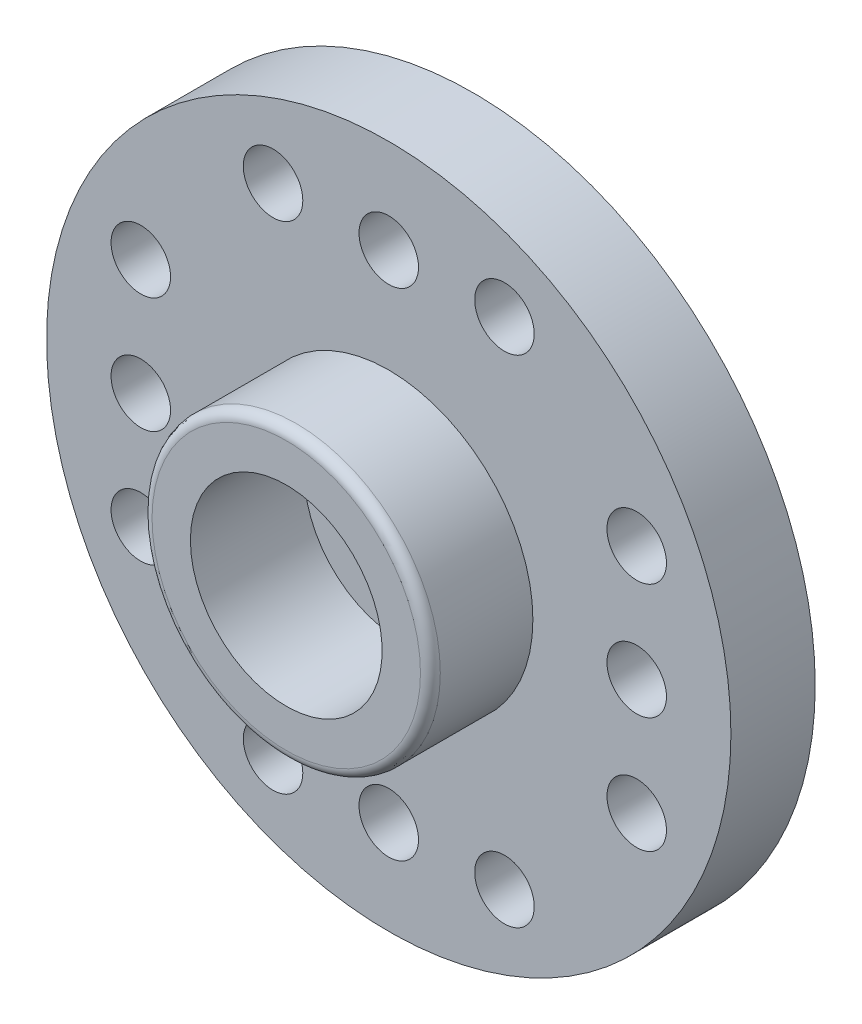
ISO-10303-21;
HEADER;
FILE_DESCRIPTION(('STEP AP214'),'2;1');
FILE_NAME('part.step','',(''),(''),'','','');
FILE_SCHEMA(('AUTOMOTIVE_DESIGN { 1 0 10303 214 1 1 1 1 }'));
ENDSEC;
DATA;
#1=APPLICATION_CONTEXT('core data for automotive mechanical design processes');
#2=APPLICATION_PROTOCOL_DEFINITION('international standard','automotive_design',2000,#1);
#3=PRODUCT_CONTEXT('',#1,'mechanical');
#4=PRODUCT('Part','Part','',(#3));
#5=PRODUCT_RELATED_PRODUCT_CATEGORY('part','',(#4));
#6=PRODUCT_DEFINITION_FORMATION('','',#4);
#7=PRODUCT_DEFINITION_CONTEXT('part definition',#1,'design');
#8=PRODUCT_DEFINITION('design','',#6,#7);
#9=PRODUCT_DEFINITION_SHAPE('','',#8);
#10=(LENGTH_UNIT() NAMED_UNIT(*) SI_UNIT(.MILLI.,.METRE.));
#11=(NAMED_UNIT(*) PLANE_ANGLE_UNIT() SI_UNIT($,.RADIAN.));
#12=(NAMED_UNIT(*) SI_UNIT($,.STERADIAN.) SOLID_ANGLE_UNIT());
#13=UNCERTAINTY_MEASURE_WITH_UNIT(LENGTH_MEASURE(1.E-05),#10,'distance_accuracy_value','');
#14=(GEOMETRIC_REPRESENTATION_CONTEXT(3) GLOBAL_UNCERTAINTY_ASSIGNED_CONTEXT((#13)) GLOBAL_UNIT_ASSIGNED_CONTEXT((#10,
#11,#12)) REPRESENTATION_CONTEXT('',''));
#15=CARTESIAN_POINT('',(0.,0.,0.));
#16=DIRECTION('',(0.,0.,1.));
#17=DIRECTION('',(1.,0.,0.));
#18=AXIS2_PLACEMENT_3D('',#15,#16,#17);
#19=CARTESIAN_POINT('',(0.,0.,9.55));
#20=DIRECTION('',(0.,0.,-1.));
#21=DIRECTION('',(-1.,0.,0.));
#22=AXIS2_PLACEMENT_3D('',#19,#20,#21);
#23=CYLINDRICAL_SURFACE('',#22,1.25);
#24=CARTESIAN_POINT('',(0.,0.,0.710000000000001));
#25=DIRECTION('',(0.,0.,-1.));
#26=DIRECTION('',(-1.,0.,0.));
#27=AXIS2_PLACEMENT_3D('',#24,#25,#26);
#28=CIRCLE('',#27,1.25);
#29=CARTESIAN_POINT('',(-1.25,0.,0.710000000000001));
#30=VERTEX_POINT('',#29);
#31=EDGE_CURVE('E108',#30,#30,#28,.F.);
#32=ORIENTED_EDGE('',*,*,#31,.F.);
#33=EDGE_LOOP('',(#32));
#34=FACE_BOUND('',#33,.T.);
#35=CARTESIAN_POINT('',(0.,0.,2.2));
#36=DIRECTION('',(0.,0.,1.));
#37=DIRECTION('',(1.,0.,0.));
#38=AXIS2_PLACEMENT_3D('',#35,#36,#37);
#39=CIRCLE('',#38,1.25);
#40=CARTESIAN_POINT('',(1.25,0.,2.2));
#41=VERTEX_POINT('',#40);
#42=EDGE_CURVE('E36',#41,#41,#39,.T.);
#43=ORIENTED_EDGE('',*,*,#42,.T.);
#44=EDGE_LOOP('',(#43));
#45=FACE_BOUND('',#44,.T.);
#46=ADVANCED_FACE('F32',(#34,#45),#23,.F.);
#47=CARTESIAN_POINT('',(0.,0.,2.55));
#48=DIRECTION('',(0.,0.,-1.));
#49=DIRECTION('',(-1.,0.,0.));
#50=AXIS2_PLACEMENT_3D('',#47,#48,#49);
#51=CYLINDRICAL_SURFACE('',#50,10.35);
#52=CARTESIAN_POINT('',(0.,0.,2.55));
#53=DIRECTION('',(0.,0.,1.));
#54=DIRECTION('',(1.,0.,0.));
#55=AXIS2_PLACEMENT_3D('',#52,#53,#54);
#56=CIRCLE('',#55,10.35);
#57=CARTESIAN_POINT('',(10.35,0.,2.55));
#58=VERTEX_POINT('',#57);
#59=EDGE_CURVE('E122',#58,#58,#56,.T.);
#60=ORIENTED_EDGE('',*,*,#59,.F.);
#61=EDGE_LOOP('',(#60));
#62=FACE_BOUND('',#61,.T.);
#63=CARTESIAN_POINT('',(0.,0.,0.));
#64=DIRECTION('',(0.,0.,1.));
#65=DIRECTION('',(1.,0.,0.));
#66=AXIS2_PLACEMENT_3D('',#63,#64,#65);
#67=CIRCLE('',#66,10.35);
#68=CARTESIAN_POINT('',(10.35,0.,0.));
#69=VERTEX_POINT('',#68);
#70=EDGE_CURVE('E121',#69,#69,#67,.T.);
#71=ORIENTED_EDGE('',*,*,#70,.T.);
#72=EDGE_LOOP('',(#71));
#73=FACE_BOUND('',#72,.T.);
#74=ADVANCED_FACE('F142',(#62,#73),#51,.T.);
#75=CARTESIAN_POINT('',(0.,0.,2.55));
#76=DIRECTION('',(0.,0.,1.));
#77=DIRECTION('',(1.,0.,0.));
#78=AXIS2_PLACEMENT_3D('',#75,#76,#77);
#79=PLANE('',#78);
#80=CARTESIAN_POINT('',(0.,-7.5,2.55));
#81=DIRECTION('',(0.,0.,1.));
#82=DIRECTION('',(1.,0.,0.));
#83=AXIS2_PLACEMENT_3D('',#80,#81,#82);
#84=CIRCLE('',#83,0.9);
#85=CARTESIAN_POINT('',(0.9,-7.5,2.55));
#86=VERTEX_POINT('',#85);
#87=EDGE_CURVE('E53',#86,#86,#84,.F.);
#88=ORIENTED_EDGE('',*,*,#87,.T.);
#89=EDGE_LOOP('',(#88));
#90=FACE_BOUND('',#89,.T.);
#91=CARTESIAN_POINT('',(-3.5,-7.5,2.55));
#92=DIRECTION('',(0.,0.,1.));
#93=DIRECTION('',(1.,0.,0.));
#94=AXIS2_PLACEMENT_3D('',#91,#92,#93);
#95=CIRCLE('',#94,0.9);
#96=CARTESIAN_POINT('',(-2.6,-7.5,2.55));
#97=VERTEX_POINT('',#96);
#98=EDGE_CURVE('E92',#97,#97,#95,.F.);
#99=ORIENTED_EDGE('',*,*,#98,.T.);
#100=EDGE_LOOP('',(#99));
#101=FACE_BOUND('',#100,.T.);
#102=CARTESIAN_POINT('',(3.5,-7.5,2.55));
#103=DIRECTION('',(0.,0.,1.));
#104=DIRECTION('',(1.,0.,0.));
#105=AXIS2_PLACEMENT_3D('',#102,#103,#104);
#106=CIRCLE('',#105,0.9);
#107=CARTESIAN_POINT('',(4.4,-7.5,2.55));
#108=VERTEX_POINT('',#107);
#109=EDGE_CURVE('E89',#108,#108,#106,.F.);
#110=ORIENTED_EDGE('',*,*,#109,.T.);
#111=EDGE_LOOP('',(#110));
#112=FACE_BOUND('',#111,.T.);
#113=CARTESIAN_POINT('',(-7.5,0.,2.55));
#114=DIRECTION('',(0.,0.,1.));
#115=DIRECTION('',(1.,0.,0.));
#116=AXIS2_PLACEMENT_3D('',#113,#114,#115);
#117=CIRCLE('',#116,0.9);
#118=CARTESIAN_POINT('',(-6.6,0.,2.55));
#119=VERTEX_POINT('',#118);
#120=EDGE_CURVE('E85',#119,#119,#117,.F.);
#121=ORIENTED_EDGE('',*,*,#120,.T.);
#122=EDGE_LOOP('',(#121));
#123=FACE_BOUND('',#122,.T.);
#124=CARTESIAN_POINT('',(-7.5,3.5,2.55));
#125=DIRECTION('',(0.,0.,1.));
#126=DIRECTION('',(1.,0.,0.));
#127=AXIS2_PLACEMENT_3D('',#124,#125,#126);
#128=CIRCLE('',#127,0.9);
#129=CARTESIAN_POINT('',(-6.6,3.5,2.55));
#130=VERTEX_POINT('',#129);
#131=EDGE_CURVE('E81',#130,#130,#128,.F.);
#132=ORIENTED_EDGE('',*,*,#131,.T.);
#133=EDGE_LOOP('',(#132));
#134=FACE_BOUND('',#133,.T.);
#135=CARTESIAN_POINT('',(-7.5,-3.5,2.55));
#136=DIRECTION('',(0.,0.,1.));
#137=DIRECTION('',(1.,0.,0.));
#138=AXIS2_PLACEMENT_3D('',#135,#136,#137);
#139=CIRCLE('',#138,0.9);
#140=CARTESIAN_POINT('',(-6.6,-3.5,2.55));
#141=VERTEX_POINT('',#140);
#142=EDGE_CURVE('E77',#141,#141,#139,.F.);
#143=ORIENTED_EDGE('',*,*,#142,.T.);
#144=EDGE_LOOP('',(#143));
#145=FACE_BOUND('',#144,.T.);
#146=CARTESIAN_POINT('',(7.5,0.,2.55));
#147=DIRECTION('',(0.,0.,1.));
#148=DIRECTION('',(1.,0.,0.));
#149=AXIS2_PLACEMENT_3D('',#146,#147,#148);
#150=CIRCLE('',#149,0.9);
#151=CARTESIAN_POINT('',(8.4,0.,2.55));
#152=VERTEX_POINT('',#151);
#153=EDGE_CURVE('E73',#152,#152,#150,.F.);
#154=ORIENTED_EDGE('',*,*,#153,.T.);
#155=EDGE_LOOP('',(#154));
#156=FACE_BOUND('',#155,.T.);
#157=CARTESIAN_POINT('',(7.5,3.5,2.55));
#158=DIRECTION('',(0.,0.,1.));
#159=DIRECTION('',(1.,0.,0.));
#160=AXIS2_PLACEMENT_3D('',#157,#158,#159);
#161=CIRCLE('',#160,0.9);
#162=CARTESIAN_POINT('',(8.4,3.5,2.55));
#163=VERTEX_POINT('',#162);
#164=EDGE_CURVE('E69',#163,#163,#161,.F.);
#165=ORIENTED_EDGE('',*,*,#164,.T.);
#166=EDGE_LOOP('',(#165));
#167=FACE_BOUND('',#166,.T.);
#168=CARTESIAN_POINT('',(7.5,-3.5,2.55));
#169=DIRECTION('',(0.,0.,1.));
#170=DIRECTION('',(1.,0.,0.));
#171=AXIS2_PLACEMENT_3D('',#168,#169,#170);
#172=CIRCLE('',#171,0.9);
#173=CARTESIAN_POINT('',(8.4,-3.5,2.55));
#174=VERTEX_POINT('',#173);
#175=EDGE_CURVE('E65',#174,#174,#172,.F.);
#176=ORIENTED_EDGE('',*,*,#175,.T.);
#177=EDGE_LOOP('',(#176));
#178=FACE_BOUND('',#177,.T.);
#179=CARTESIAN_POINT('',(3.5,7.5,2.55));
#180=DIRECTION('',(0.,0.,1.));
#181=DIRECTION('',(1.,0.,0.));
#182=AXIS2_PLACEMENT_3D('',#179,#180,#181);
#183=CIRCLE('',#182,0.9);
#184=CARTESIAN_POINT('',(4.4,7.5,2.55));
#185=VERTEX_POINT('',#184);
#186=EDGE_CURVE('E61',#185,#185,#183,.F.);
#187=ORIENTED_EDGE('',*,*,#186,.T.);
#188=EDGE_LOOP('',(#187));
#189=FACE_BOUND('',#188,.T.);
#190=CARTESIAN_POINT('',(-3.5,7.5,2.55));
#191=DIRECTION('',(0.,0.,1.));
#192=DIRECTION('',(1.,0.,0.));
#193=AXIS2_PLACEMENT_3D('',#190,#191,#192);
#194=CIRCLE('',#193,0.9);
#195=CARTESIAN_POINT('',(-2.6,7.5,2.55));
#196=VERTEX_POINT('',#195);
#197=EDGE_CURVE('E57',#196,#196,#194,.F.);
#198=ORIENTED_EDGE('',*,*,#197,.T.);
#199=EDGE_LOOP('',(#198));
#200=FACE_BOUND('',#199,.T.);
#201=CARTESIAN_POINT('',(0.,7.5,2.55));
#202=DIRECTION('',(0.,0.,1.));
#203=DIRECTION('',(1.,0.,0.));
#204=AXIS2_PLACEMENT_3D('',#201,#202,#203);
#205=CIRCLE('',#204,0.9);
#206=CARTESIAN_POINT('',(0.9,7.5,2.55));
#207=VERTEX_POINT('',#206);
#208=EDGE_CURVE('E52',#207,#207,#205,.F.);
#209=ORIENTED_EDGE('',*,*,#208,.T.);
#210=EDGE_LOOP('',(#209));
#211=FACE_BOUND('',#210,.T.);
#212=CARTESIAN_POINT('',(0.,0.,2.55));
#213=DIRECTION('',(0.,0.,1.));
#214=DIRECTION('',(1.,0.,0.));
#215=AXIS2_PLACEMENT_3D('',#212,#213,#214);
#216=CIRCLE('',#215,4.36);
#217=CARTESIAN_POINT('',(-4.36,0.,2.55));
#218=VERTEX_POINT('',#217);
#219=EDGE_CURVE('E118',#218,#218,#216,.T.);
#220=ORIENTED_EDGE('',*,*,#219,.F.);
#221=EDGE_LOOP('',(#220));
#222=FACE_BOUND('',#221,.T.);
#223=ORIENTED_EDGE('',*,*,#59,.T.);
#224=EDGE_LOOP('',(#223));
#225=FACE_BOUND('',#224,.T.);
#226=ADVANCED_FACE('F169',(#90,#101,#112,#123,#134,#145,#156,#167,#178,#189,#200,#211,#222,
#225),#79,.T.);
#227=CARTESIAN_POINT('',(0.,0.,0.));
#228=DIRECTION('',(0.,0.,1.));
#229=DIRECTION('',(1.,0.,0.));
#230=AXIS2_PLACEMENT_3D('',#227,#228,#229);
#231=PLANE('',#230);
#232=CARTESIAN_POINT('',(0.,-7.5,0.));
#233=DIRECTION('',(0.,0.,1.));
#234=DIRECTION('',(1.,0.,0.));
#235=AXIS2_PLACEMENT_3D('',#232,#233,#234);
#236=CIRCLE('',#235,0.9);
#237=CARTESIAN_POINT('',(0.9,-7.5,0.));
#238=VERTEX_POINT('',#237);
#239=EDGE_CURVE('E93',#238,#238,#236,.F.);
#240=ORIENTED_EDGE('',*,*,#239,.F.);
#241=EDGE_LOOP('',(#240));
#242=FACE_BOUND('',#241,.T.);
#243=CARTESIAN_POINT('',(-3.5,-7.5,0.));
#244=DIRECTION('',(0.,0.,1.));
#245=DIRECTION('',(1.,0.,0.));
#246=AXIS2_PLACEMENT_3D('',#243,#244,#245);
#247=CIRCLE('',#246,0.9);
#248=CARTESIAN_POINT('',(-2.6,-7.5,0.));
#249=VERTEX_POINT('',#248);
#250=EDGE_CURVE('E90',#249,#249,#247,.F.);
#251=ORIENTED_EDGE('',*,*,#250,.F.);
#252=EDGE_LOOP('',(#251));
#253=FACE_BOUND('',#252,.T.);
#254=CARTESIAN_POINT('',(3.5,-7.5,0.));
#255=DIRECTION('',(0.,0.,1.));
#256=DIRECTION('',(1.,0.,0.));
#257=AXIS2_PLACEMENT_3D('',#254,#255,#256);
#258=CIRCLE('',#257,0.9);
#259=CARTESIAN_POINT('',(4.4,-7.5,0.));
#260=VERTEX_POINT('',#259);
#261=EDGE_CURVE('E86',#260,#260,#258,.F.);
#262=ORIENTED_EDGE('',*,*,#261,.F.);
#263=EDGE_LOOP('',(#262));
#264=FACE_BOUND('',#263,.T.);
#265=CARTESIAN_POINT('',(-7.5,0.,0.));
#266=DIRECTION('',(0.,0.,1.));
#267=DIRECTION('',(1.,0.,0.));
#268=AXIS2_PLACEMENT_3D('',#265,#266,#267);
#269=CIRCLE('',#268,0.9);
#270=CARTESIAN_POINT('',(-6.6,0.,0.));
#271=VERTEX_POINT('',#270);
#272=EDGE_CURVE('E82',#271,#271,#269,.F.);
#273=ORIENTED_EDGE('',*,*,#272,.F.);
#274=EDGE_LOOP('',(#273));
#275=FACE_BOUND('',#274,.T.);
#276=CARTESIAN_POINT('',(-7.5,3.5,0.));
#277=DIRECTION('',(0.,0.,1.));
#278=DIRECTION('',(1.,0.,0.));
#279=AXIS2_PLACEMENT_3D('',#276,#277,#278);
#280=CIRCLE('',#279,0.9);
#281=CARTESIAN_POINT('',(-6.6,3.5,0.));
#282=VERTEX_POINT('',#281);
#283=EDGE_CURVE('E78',#282,#282,#280,.F.);
#284=ORIENTED_EDGE('',*,*,#283,.F.);
#285=EDGE_LOOP('',(#284));
#286=FACE_BOUND('',#285,.T.);
#287=CARTESIAN_POINT('',(-7.5,-3.5,0.));
#288=DIRECTION('',(0.,0.,1.));
#289=DIRECTION('',(1.,0.,0.));
#290=AXIS2_PLACEMENT_3D('',#287,#288,#289);
#291=CIRCLE('',#290,0.9);
#292=CARTESIAN_POINT('',(-6.6,-3.5,0.));
#293=VERTEX_POINT('',#292);
#294=EDGE_CURVE('E74',#293,#293,#291,.F.);
#295=ORIENTED_EDGE('',*,*,#294,.F.);
#296=EDGE_LOOP('',(#295));
#297=FACE_BOUND('',#296,.T.);
#298=CARTESIAN_POINT('',(7.5,0.,0.));
#299=DIRECTION('',(0.,0.,1.));
#300=DIRECTION('',(1.,0.,0.));
#301=AXIS2_PLACEMENT_3D('',#298,#299,#300);
#302=CIRCLE('',#301,0.9);
#303=CARTESIAN_POINT('',(8.4,0.,0.));
#304=VERTEX_POINT('',#303);
#305=EDGE_CURVE('E70',#304,#304,#302,.F.);
#306=ORIENTED_EDGE('',*,*,#305,.F.);
#307=EDGE_LOOP('',(#306));
#308=FACE_BOUND('',#307,.T.);
#309=CARTESIAN_POINT('',(7.5,3.5,0.));
#310=DIRECTION('',(0.,0.,1.));
#311=DIRECTION('',(1.,0.,0.));
#312=AXIS2_PLACEMENT_3D('',#309,#310,#311);
#313=CIRCLE('',#312,0.9);
#314=CARTESIAN_POINT('',(8.4,3.5,0.));
#315=VERTEX_POINT('',#314);
#316=EDGE_CURVE('E66',#315,#315,#313,.F.);
#317=ORIENTED_EDGE('',*,*,#316,.F.);
#318=EDGE_LOOP('',(#317));
#319=FACE_BOUND('',#318,.T.);
#320=CARTESIAN_POINT('',(7.5,-3.5,0.));
#321=DIRECTION('',(0.,0.,1.));
#322=DIRECTION('',(1.,0.,0.));
#323=AXIS2_PLACEMENT_3D('',#320,#321,#322);
#324=CIRCLE('',#323,0.9);
#325=CARTESIAN_POINT('',(8.4,-3.5,0.));
#326=VERTEX_POINT('',#325);
#327=EDGE_CURVE('E62',#326,#326,#324,.F.);
#328=ORIENTED_EDGE('',*,*,#327,.F.);
#329=EDGE_LOOP('',(#328));
#330=FACE_BOUND('',#329,.T.);
#331=CARTESIAN_POINT('',(3.5,7.5,0.));
#332=DIRECTION('',(0.,0.,1.));
#333=DIRECTION('',(1.,0.,0.));
#334=AXIS2_PLACEMENT_3D('',#331,#332,#333);
#335=CIRCLE('',#334,0.9);
#336=CARTESIAN_POINT('',(4.4,7.5,0.));
#337=VERTEX_POINT('',#336);
#338=EDGE_CURVE('E58',#337,#337,#335,.F.);
#339=ORIENTED_EDGE('',*,*,#338,.F.);
#340=EDGE_LOOP('',(#339));
#341=FACE_BOUND('',#340,.T.);
#342=CARTESIAN_POINT('',(-3.5,7.5,0.));
#343=DIRECTION('',(0.,0.,1.));
#344=DIRECTION('',(1.,0.,0.));
#345=AXIS2_PLACEMENT_3D('',#342,#343,#344);
#346=CIRCLE('',#345,0.9);
#347=CARTESIAN_POINT('',(-2.6,7.5,0.));
#348=VERTEX_POINT('',#347);
#349=EDGE_CURVE('E54',#348,#348,#346,.F.);
#350=ORIENTED_EDGE('',*,*,#349,.F.);
#351=EDGE_LOOP('',(#350));
#352=FACE_BOUND('',#351,.T.);
#353=CARTESIAN_POINT('',(0.,7.5,0.));
#354=DIRECTION('',(0.,0.,1.));
#355=DIRECTION('',(1.,0.,0.));
#356=AXIS2_PLACEMENT_3D('',#353,#354,#355);
#357=CIRCLE('',#356,0.9);
#358=CARTESIAN_POINT('',(0.9,7.5,0.));
#359=VERTEX_POINT('',#358);
#360=EDGE_CURVE('E49',#359,#359,#357,.F.);
#361=ORIENTED_EDGE('',*,*,#360,.F.);
#362=EDGE_LOOP('',(#361));
#363=FACE_BOUND('',#362,.T.);
#364=CARTESIAN_POINT('',(0.,0.,0.));
#365=DIRECTION('',(0.,0.,1.));
#366=DIRECTION('',(1.,0.,0.));
#367=AXIS2_PLACEMENT_3D('',#364,#365,#366);
#368=CIRCLE('',#367,4.36);
#369=CARTESIAN_POINT('',(4.36,0.,0.));
#370=VERTEX_POINT('',#369);
#371=EDGE_CURVE('E125',#370,#370,#368,.F.);
#372=ORIENTED_EDGE('',*,*,#371,.F.);
#373=EDGE_LOOP('',(#372));
#374=FACE_BOUND('',#373,.T.);
#375=ORIENTED_EDGE('',*,*,#70,.F.);
#376=EDGE_LOOP('',(#375));
#377=FACE_BOUND('',#376,.T.);
#378=ADVANCED_FACE('F180',(#242,#253,#264,#275,#286,#297,#308,#319,#330,#341,#352,#363,#374,
#377),#231,.F.);
#379=CARTESIAN_POINT('',(0.,0.,5.65));
#380=DIRECTION('',(0.,0.,1.));
#381=DIRECTION('',(1.,0.,0.));
#382=AXIS2_PLACEMENT_3D('',#379,#380,#381);
#383=PLANE('',#382);
#384=CARTESIAN_POINT('',(0.,0.,5.65));
#385=DIRECTION('',(0.,0.,1.));
#386=DIRECTION('',(1.,0.,0.));
#387=AXIS2_PLACEMENT_3D('',#384,#385,#386);
#388=CIRCLE('',#387,4.06);
#389=CARTESIAN_POINT('',(4.06,0.,5.65));
#390=VERTEX_POINT('',#389);
#391=EDGE_CURVE('E40',#390,#390,#388,.T.);
#392=ORIENTED_EDGE('',*,*,#391,.T.);
#393=EDGE_LOOP('',(#392));
#394=FACE_BOUND('',#393,.T.);
#395=CARTESIAN_POINT('',(0.,0.,5.65));
#396=DIRECTION('',(0.,0.,1.));
#397=DIRECTION('',(1.,0.,0.));
#398=AXIS2_PLACEMENT_3D('',#395,#396,#397);
#399=CIRCLE('',#398,2.9);
#400=CARTESIAN_POINT('',(-2.9,0.,5.65));
#401=VERTEX_POINT('',#400);
#402=EDGE_CURVE('E112',#401,#401,#399,.T.);
#403=ORIENTED_EDGE('',*,*,#402,.F.);
#404=EDGE_LOOP('',(#403));
#405=FACE_BOUND('',#404,.T.);
#406=ADVANCED_FACE('F183',(#394,#405),#383,.T.);
#407=CARTESIAN_POINT('',(0.,0.,5.65));
#408=DIRECTION('',(0.,0.,-1.));
#409=DIRECTION('',(-1.,0.,0.));
#410=AXIS2_PLACEMENT_3D('',#407,#408,#409);
#411=CYLINDRICAL_SURFACE('',#410,4.36);
#412=CARTESIAN_POINT('',(0.,0.,5.35));
#413=DIRECTION('',(0.,0.,1.));
#414=DIRECTION('',(1.,0.,0.));
#415=AXIS2_PLACEMENT_3D('',#412,#413,#414);
#416=CIRCLE('',#415,4.36);
#417=CARTESIAN_POINT('',(-4.36,0.,5.35));
#418=VERTEX_POINT('',#417);
#419=EDGE_CURVE('E10',#418,#418,#416,.F.);
#420=CARTESIAN_POINT('',(-4.36,0.,5.35));
#421=CARTESIAN_POINT('',(-4.36,0.,5.32083333333333));
#422=CARTESIAN_POINT('',(-4.36,0.,5.29166666666667));
#423=CARTESIAN_POINT('',(-4.36,0.,5.23333333333333));
#424=CARTESIAN_POINT('',(-4.36,0.,5.20416666666667));
#425=CARTESIAN_POINT('',(-4.36,0.,5.14583333333333));
#426=CARTESIAN_POINT('',(-4.36,0.,5.11666666666667));
#427=CARTESIAN_POINT('',(-4.36,0.,5.05833333333333));
#428=CARTESIAN_POINT('',(-4.36,0.,5.02916666666667));
#429=CARTESIAN_POINT('',(-4.36,0.,4.97083333333333));
#430=CARTESIAN_POINT('',(-4.36,0.,4.94166666666667));
#431=CARTESIAN_POINT('',(-4.36,0.,4.88333333333333));
#432=CARTESIAN_POINT('',(-4.36,0.,4.85416666666667));
#433=CARTESIAN_POINT('',(-4.36,0.,4.79583333333333));
#434=CARTESIAN_POINT('',(-4.36,0.,4.76666666666667));
#435=CARTESIAN_POINT('',(-4.36,0.,4.70833333333333));
#436=CARTESIAN_POINT('',(-4.36,0.,4.67916666666667));
#437=CARTESIAN_POINT('',(-4.36,0.,4.62083333333333));
#438=CARTESIAN_POINT('',(-4.36,0.,4.59166666666667));
#439=CARTESIAN_POINT('',(-4.36,0.,4.53333333333333));
#440=CARTESIAN_POINT('',(-4.36,0.,4.50416666666667));
#441=CARTESIAN_POINT('',(-4.36,0.,4.44583333333333));
#442=CARTESIAN_POINT('',(-4.36,0.,4.41666666666667));
#443=CARTESIAN_POINT('',(-4.36,0.,4.35833333333333));
#444=CARTESIAN_POINT('',(-4.36,0.,4.32916666666667));
#445=CARTESIAN_POINT('',(-4.36,0.,4.27083333333333));
#446=CARTESIAN_POINT('',(-4.36,0.,4.24166666666667));
#447=CARTESIAN_POINT('',(-4.36,0.,4.18333333333333));
#448=CARTESIAN_POINT('',(-4.36,0.,4.15416666666667));
#449=CARTESIAN_POINT('',(-4.36,0.,4.09583333333333));
#450=CARTESIAN_POINT('',(-4.36,0.,4.06666666666667));
#451=CARTESIAN_POINT('',(-4.36,0.,4.00833333333333));
#452=CARTESIAN_POINT('',(-4.36,0.,3.97916666666667));
#453=CARTESIAN_POINT('',(-4.36,0.,3.92083333333333));
#454=CARTESIAN_POINT('',(-4.36,0.,3.89166666666667));
#455=CARTESIAN_POINT('',(-4.36,0.,3.83333333333333));
#456=CARTESIAN_POINT('',(-4.36,0.,3.80416666666667));
#457=CARTESIAN_POINT('',(-4.36,0.,3.74583333333333));
#458=CARTESIAN_POINT('',(-4.36,0.,3.71666666666667));
#459=CARTESIAN_POINT('',(-4.36,0.,3.65833333333333));
#460=CARTESIAN_POINT('',(-4.36,0.,3.62916666666667));
#461=CARTESIAN_POINT('',(-4.36,0.,3.57083333333333));
#462=CARTESIAN_POINT('',(-4.36,0.,3.54166666666667));
#463=CARTESIAN_POINT('',(-4.36,0.,3.48333333333333));
#464=CARTESIAN_POINT('',(-4.36,0.,3.45416666666667));
#465=CARTESIAN_POINT('',(-4.36,0.,3.39583333333333));
#466=CARTESIAN_POINT('',(-4.36,0.,3.36666666666667));
#467=CARTESIAN_POINT('',(-4.36,0.,3.30833333333333));
#468=CARTESIAN_POINT('',(-4.36,0.,3.27916666666667));
#469=CARTESIAN_POINT('',(-4.36,0.,3.22083333333333));
#470=CARTESIAN_POINT('',(-4.36,0.,3.19166666666667));
#471=CARTESIAN_POINT('',(-4.36,0.,3.13333333333333));
#472=CARTESIAN_POINT('',(-4.36,0.,3.10416666666667));
#473=CARTESIAN_POINT('',(-4.36,0.,3.04583333333333));
#474=CARTESIAN_POINT('',(-4.36,0.,3.01666666666667));
#475=CARTESIAN_POINT('',(-4.36,0.,2.95833333333333));
#476=CARTESIAN_POINT('',(-4.36,0.,2.92916666666667));
#477=CARTESIAN_POINT('',(-4.36,0.,2.87083333333333));
#478=CARTESIAN_POINT('',(-4.36,0.,2.84166666666667));
#479=CARTESIAN_POINT('',(-4.36,0.,2.78333333333333));
#480=CARTESIAN_POINT('',(-4.36,0.,2.75416666666667));
#481=CARTESIAN_POINT('',(-4.36,0.,2.69583333333333));
#482=CARTESIAN_POINT('',(-4.36,0.,2.66666666666667));
#483=CARTESIAN_POINT('',(-4.36,0.,2.60833333333333));
#484=CARTESIAN_POINT('',(-4.36,0.,2.57916666666667));
#485=CARTESIAN_POINT('',(-4.36,0.,2.55));
#486=B_SPLINE_CURVE_WITH_KNOTS('',3,(#420,#421,#422,#423,#424,#425,#426,#427,#428,#429,#430,
#431,#432,#433,#434,#435,#436,#437,#438,#439,#440,#441,#442,#443,#444,#445,#446,#447,#448,#449,
#450,#451,#452,#453,#454,#455,#456,#457,#458,#459,#460,#461,#462,#463,#464,#465,#466,#467,#468,
#469,#470,#471,#472,#473,#474,#475,#476,#477,#478,#479,#480,#481,#482,#483,#484,#485),
.UNSPECIFIED.,.F.,.F.,(4,2,2,2,2,2,2,2,2,2,2,2,2,2,2,2,2,2,2,2,2,2,2,2,2,2,2,2,2,2,2,2,4),(0.,
0.0875000000000008,0.175000000000001,0.262500000000001,0.35,0.4375,0.525,0.6125,0.7,0.7875,
0.875,0.962500000000001,1.05,1.1375,1.225,1.3125,1.4,1.4875,1.575,1.6625,1.75,1.8375,1.925,
2.0125,2.1,2.1875,2.275,2.3625,2.45,2.5375,2.625,2.7125,2.8),.UNSPECIFIED.);
#487=EDGE_CURVE('BSEAM241',#418,#218,#486,.T.);
#488=ORIENTED_EDGE('',*,*,#419,.T.);
#489=ORIENTED_EDGE('',*,*,#219,.T.);
#490=ORIENTED_EDGE('',*,*,#487,.T.);
#491=ORIENTED_EDGE('',*,*,#487,.F.);
#492=EDGE_LOOP('',(#488,#490,#489,#491));
#493=FACE_BOUND('',#492,.T.);
#494=ADVANCED_FACE('F241',(#493),#411,.T.);
#495=CARTESIAN_POINT('',(0.,0.,5.65));
#496=DIRECTION('',(0.,0.,-1.));
#497=DIRECTION('',(-1.,0.,0.));
#498=AXIS2_PLACEMENT_3D('',#495,#496,#497);
#499=CYLINDRICAL_SURFACE('',#498,2.9);
#500=CARTESIAN_POINT('',(0.,0.,2.2));
#501=DIRECTION('',(0.,0.,1.));
#502=DIRECTION('',(1.,0.,0.));
#503=AXIS2_PLACEMENT_3D('',#500,#501,#502);
#504=CIRCLE('',#503,2.9);
#505=CARTESIAN_POINT('',(-2.9,0.,2.2));
#506=VERTEX_POINT('',#505);
#507=EDGE_CURVE('E147',#506,#506,#504,.T.);
#508=CARTESIAN_POINT('',(-2.9,0.,5.65));
#509=CARTESIAN_POINT('',(-2.9,0.,5.6140625));
#510=CARTESIAN_POINT('',(-2.9,0.,5.578125));
#511=CARTESIAN_POINT('',(-2.9,0.,5.50625));
#512=CARTESIAN_POINT('',(-2.9,0.,5.4703125));
#513=CARTESIAN_POINT('',(-2.9,0.,5.3984375));
#514=CARTESIAN_POINT('',(-2.9,0.,5.3625));
#515=CARTESIAN_POINT('',(-2.9,0.,5.290625));
#516=CARTESIAN_POINT('',(-2.9,0.,5.2546875));
#517=CARTESIAN_POINT('',(-2.9,0.,5.1828125));
#518=CARTESIAN_POINT('',(-2.9,0.,5.146875));
#519=CARTESIAN_POINT('',(-2.9,0.,5.075));
#520=CARTESIAN_POINT('',(-2.9,0.,5.0390625));
#521=CARTESIAN_POINT('',(-2.9,0.,4.9671875));
#522=CARTESIAN_POINT('',(-2.9,0.,4.93125));
#523=CARTESIAN_POINT('',(-2.9,0.,4.859375));
#524=CARTESIAN_POINT('',(-2.9,0.,4.8234375));
#525=CARTESIAN_POINT('',(-2.9,0.,4.7515625));
#526=CARTESIAN_POINT('',(-2.9,0.,4.715625));
#527=CARTESIAN_POINT('',(-2.9,0.,4.64375));
#528=CARTESIAN_POINT('',(-2.9,0.,4.6078125));
#529=CARTESIAN_POINT('',(-2.9,0.,4.5359375));
#530=CARTESIAN_POINT('',(-2.9,0.,4.5));
#531=CARTESIAN_POINT('',(-2.9,0.,4.428125));
#532=CARTESIAN_POINT('',(-2.9,0.,4.3921875));
#533=CARTESIAN_POINT('',(-2.9,0.,4.3203125));
#534=CARTESIAN_POINT('',(-2.9,0.,4.284375));
#535=CARTESIAN_POINT('',(-2.9,0.,4.2125));
#536=CARTESIAN_POINT('',(-2.9,0.,4.1765625));
#537=CARTESIAN_POINT('',(-2.9,0.,4.1046875));
#538=CARTESIAN_POINT('',(-2.9,0.,4.06875));
#539=CARTESIAN_POINT('',(-2.9,0.,3.996875));
#540=CARTESIAN_POINT('',(-2.9,0.,3.9609375));
#541=CARTESIAN_POINT('',(-2.9,0.,3.8890625));
#542=CARTESIAN_POINT('',(-2.9,0.,3.853125));
#543=CARTESIAN_POINT('',(-2.9,0.,3.78125));
#544=CARTESIAN_POINT('',(-2.9,0.,3.7453125));
#545=CARTESIAN_POINT('',(-2.9,0.,3.6734375));
#546=CARTESIAN_POINT('',(-2.9,0.,3.6375));
#547=CARTESIAN_POINT('',(-2.9,0.,3.565625));
#548=CARTESIAN_POINT('',(-2.9,0.,3.5296875));
#549=CARTESIAN_POINT('',(-2.9,0.,3.4578125));
#550=CARTESIAN_POINT('',(-2.9,0.,3.421875));
#551=CARTESIAN_POINT('',(-2.9,0.,3.35));
#552=CARTESIAN_POINT('',(-2.9,0.,3.3140625));
#553=CARTESIAN_POINT('',(-2.9,0.,3.2421875));
#554=CARTESIAN_POINT('',(-2.9,0.,3.20625));
#555=CARTESIAN_POINT('',(-2.9,0.,3.134375));
#556=CARTESIAN_POINT('',(-2.9,0.,3.0984375));
#557=CARTESIAN_POINT('',(-2.9,0.,3.0265625));
#558=CARTESIAN_POINT('',(-2.9,0.,2.990625));
#559=CARTESIAN_POINT('',(-2.9,0.,2.91875));
#560=CARTESIAN_POINT('',(-2.9,0.,2.8828125));
#561=CARTESIAN_POINT('',(-2.9,0.,2.8109375));
#562=CARTESIAN_POINT('',(-2.9,0.,2.775));
#563=CARTESIAN_POINT('',(-2.9,0.,2.703125));
#564=CARTESIAN_POINT('',(-2.9,0.,2.6671875));
#565=CARTESIAN_POINT('',(-2.9,0.,2.5953125));
#566=CARTESIAN_POINT('',(-2.9,0.,2.559375));
#567=CARTESIAN_POINT('',(-2.9,0.,2.4875));
#568=CARTESIAN_POINT('',(-2.9,0.,2.4515625));
#569=CARTESIAN_POINT('',(-2.9,0.,2.3796875));
#570=CARTESIAN_POINT('',(-2.9,0.,2.34375));
#571=CARTESIAN_POINT('',(-2.9,0.,2.271875));
#572=CARTESIAN_POINT('',(-2.9,0.,2.2359375));
#573=CARTESIAN_POINT('',(-2.9,0.,2.2));
#574=B_SPLINE_CURVE_WITH_KNOTS('',3,(#508,#509,#510,#511,#512,#513,#514,#515,#516,#517,#518,
#519,#520,#521,#522,#523,#524,#525,#526,#527,#528,#529,#530,#531,#532,#533,#534,#535,#536,#537,
#538,#539,#540,#541,#542,#543,#544,#545,#546,#547,#548,#549,#550,#551,#552,#553,#554,#555,#556,
#557,#558,#559,#560,#561,#562,#563,#564,#565,#566,#567,#568,#569,#570,#571,#572,#573),
.UNSPECIFIED.,.F.,.F.,(4,2,2,2,2,2,2,2,2,2,2,2,2,2,2,2,2,2,2,2,2,2,2,2,2,2,2,2,2,2,2,2,4),(0.,
0.107812499999999,0.215625,0.3234375,0.431249999999999,0.5390625,0.646875,0.754687499999999,
0.8625,0.9703125,1.078125,1.1859375,1.29375,1.4015625,1.509375,1.6171875,1.725,1.8328125,
1.940625,2.0484375,2.15625,2.2640625,2.371875,2.4796875,2.5875,2.6953125,2.803125,2.9109375,
3.01875,3.1265625,3.234375,3.3421875,3.45),.UNSPECIFIED.);
#575=EDGE_CURVE('BSEAM236',#401,#506,#574,.T.);
#576=ORIENTED_EDGE('',*,*,#402,.T.);
#577=ORIENTED_EDGE('',*,*,#507,.F.);
#578=ORIENTED_EDGE('',*,*,#575,.T.);
#579=ORIENTED_EDGE('',*,*,#575,.F.);
#580=EDGE_LOOP('',(#576,#578,#577,#579));
#581=FACE_BOUND('',#580,.T.);
#582=ADVANCED_FACE('F236',(#581),#499,.F.);
#583=CARTESIAN_POINT('',(0.,0.,-0.49));
#584=DIRECTION('',(0.,0.,1.));
#585=DIRECTION('',(1.,0.,0.));
#586=AXIS2_PLACEMENT_3D('',#583,#584,#585);
#587=CYLINDRICAL_SURFACE('',#586,4.36);
#588=CARTESIAN_POINT('',(0.,0.,-0.0099999999999952));
#589=DIRECTION('',(0.,0.,-1.));
#590=DIRECTION('',(-1.,0.,0.));
#591=AXIS2_PLACEMENT_3D('',#588,#589,#590);
#592=CIRCLE('',#591,4.36);
#593=CARTESIAN_POINT('',(-4.36,0.,-0.0099999999999952));
#594=VERTEX_POINT('',#593);
#595=EDGE_CURVE('E45',#594,#594,#592,.F.);
#596=ORIENTED_EDGE('',*,*,#595,.T.);
#597=EDGE_LOOP('',(#596));
#598=FACE_BOUND('',#597,.T.);
#599=ORIENTED_EDGE('',*,*,#371,.T.);
#600=EDGE_LOOP('',(#599));
#601=FACE_BOUND('',#600,.T.);
#602=ADVANCED_FACE('F226',(#598,#601),#587,.T.);
#603=CARTESIAN_POINT('',(0.,0.,-0.49));
#604=DIRECTION('',(0.,0.,-1.));
#605=DIRECTION('',(-1.,0.,0.));
#606=AXIS2_PLACEMENT_3D('',#603,#604,#605);
#607=PLANE('',#606);
#608=CARTESIAN_POINT('',(0.,0.,-0.49));
#609=DIRECTION('',(0.,0.,-1.));
#610=DIRECTION('',(-1.,0.,0.));
#611=AXIS2_PLACEMENT_3D('',#608,#609,#610);
#612=CIRCLE('',#611,3.5);
#613=CARTESIAN_POINT('',(-3.5,0.,-0.49));
#614=VERTEX_POINT('',#613);
#615=EDGE_CURVE('E113',#614,#614,#612,.T.);
#616=ORIENTED_EDGE('',*,*,#615,.F.);
#617=EDGE_LOOP('',(#616));
#618=FACE_BOUND('',#617,.T.);
#619=CARTESIAN_POINT('',(0.,0.,-0.49));
#620=DIRECTION('',(0.,0.,-1.));
#621=DIRECTION('',(-1.,0.,0.));
#622=AXIS2_PLACEMENT_3D('',#619,#620,#621);
#623=CIRCLE('',#622,3.87999999999999);
#624=CARTESIAN_POINT('',(-3.87999999999999,0.,-0.49));
#625=VERTEX_POINT('',#624);
#626=EDGE_CURVE('E130',#625,#625,#623,.T.);
#627=ORIENTED_EDGE('',*,*,#626,.T.);
#628=EDGE_LOOP('',(#627));
#629=FACE_BOUND('',#628,.T.);
#630=ADVANCED_FACE('F218',(#618,#629),#607,.T.);
#631=CARTESIAN_POINT('',(0.,0.,-0.49));
#632=DIRECTION('',(0.,0.,1.));
#633=DIRECTION('',(1.,0.,0.));
#634=AXIS2_PLACEMENT_3D('',#631,#632,#633);
#635=CONICAL_SURFACE('',#634,3.87999999999999,0.785398163397449);
#636=ORIENTED_EDGE('',*,*,#595,.F.);
#637=EDGE_LOOP('',(#636));
#638=FACE_BOUND('',#637,.T.);
#639=ORIENTED_EDGE('',*,*,#626,.F.);
#640=EDGE_LOOP('',(#639));
#641=FACE_BOUND('',#640,.T.);
#642=ADVANCED_FACE('F215',(#638,#641),#635,.T.);
#643=CARTESIAN_POINT('',(0.,0.,0.71));
#644=DIRECTION('',(0.,0.,-1.));
#645=DIRECTION('',(-1.,0.,0.));
#646=AXIS2_PLACEMENT_3D('',#643,#644,#645);
#647=CYLINDRICAL_SURFACE('',#646,3.5);
#648=CARTESIAN_POINT('',(0.,0.,0.71));
#649=DIRECTION('',(0.,0.,-1.));
#650=DIRECTION('',(-1.,0.,0.));
#651=AXIS2_PLACEMENT_3D('',#648,#649,#650);
#652=CIRCLE('',#651,3.5);
#653=CARTESIAN_POINT('',(-3.5,0.,0.71));
#654=VERTEX_POINT('',#653);
#655=EDGE_CURVE('E109',#654,#654,#652,.T.);
#656=ORIENTED_EDGE('',*,*,#655,.F.);
#657=EDGE_LOOP('',(#656));
#658=FACE_BOUND('',#657,.T.);
#659=ORIENTED_EDGE('',*,*,#615,.T.);
#660=EDGE_LOOP('',(#659));
#661=FACE_BOUND('',#660,.T.);
#662=ADVANCED_FACE('F217',(#658,#661),#647,.F.);
#663=CARTESIAN_POINT('',(0.,0.,0.71));
#664=DIRECTION('',(0.,0.,-1.));
#665=DIRECTION('',(-1.,0.,0.));
#666=AXIS2_PLACEMENT_3D('',#663,#664,#665);
#667=PLANE('',#666);
#668=ORIENTED_EDGE('',*,*,#31,.T.);
#669=EDGE_LOOP('',(#668));
#670=FACE_BOUND('',#669,.T.);
#671=ORIENTED_EDGE('',*,*,#655,.T.);
#672=EDGE_LOOP('',(#671));
#673=FACE_BOUND('',#672,.T.);
#674=ADVANCED_FACE('F137',(#670,#673),#667,.T.);
#675=CARTESIAN_POINT('',(0.,0.,5.35));
#676=DIRECTION('',(0.,0.,1.));
#677=DIRECTION('',(1.,0.,0.));
#678=AXIS2_PLACEMENT_3D('',#675,#676,#677);
#679=TOROIDAL_SURFACE('',#678,4.06,0.3);
#680=ORIENTED_EDGE('',*,*,#419,.F.);
#681=EDGE_LOOP('',(#680));
#682=FACE_BOUND('',#681,.T.);
#683=ORIENTED_EDGE('',*,*,#391,.F.);
#684=EDGE_LOOP('',(#683));
#685=FACE_BOUND('',#684,.T.);
#686=ADVANCED_FACE('F34',(#682,#685),#679,.T.);
#687=CARTESIAN_POINT('',(0.,7.5,4.55));
#688=DIRECTION('',(0.,0.,-1.));
#689=DIRECTION('',(-1.,0.,0.));
#690=AXIS2_PLACEMENT_3D('',#687,#688,#689);
#691=CYLINDRICAL_SURFACE('',#690,0.9);
#692=ORIENTED_EDGE('',*,*,#208,.F.);
#693=EDGE_LOOP('',(#692));
#694=FACE_BOUND('',#693,.T.);
#695=ORIENTED_EDGE('',*,*,#360,.T.);
#696=EDGE_LOOP('',(#695));
#697=FACE_BOUND('',#696,.T.);
#698=ADVANCED_FACE('F358',(#694,#697),#691,.F.);
#699=CARTESIAN_POINT('',(-3.5,7.5,4.55));
#700=DIRECTION('',(0.,0.,-1.));
#701=DIRECTION('',(-1.,0.,0.));
#702=AXIS2_PLACEMENT_3D('',#699,#700,#701);
#703=CYLINDRICAL_SURFACE('',#702,0.9);
#704=ORIENTED_EDGE('',*,*,#197,.F.);
#705=EDGE_LOOP('',(#704));
#706=FACE_BOUND('',#705,.T.);
#707=ORIENTED_EDGE('',*,*,#349,.T.);
#708=EDGE_LOOP('',(#707));
#709=FACE_BOUND('',#708,.T.);
#710=ADVANCED_FACE('F350',(#706,#709),#703,.F.);
#711=CARTESIAN_POINT('',(3.5,7.5,4.55));
#712=DIRECTION('',(0.,0.,-1.));
#713=DIRECTION('',(-1.,0.,0.));
#714=AXIS2_PLACEMENT_3D('',#711,#712,#713);
#715=CYLINDRICAL_SURFACE('',#714,0.9);
#716=ORIENTED_EDGE('',*,*,#186,.F.);
#717=EDGE_LOOP('',(#716));
#718=FACE_BOUND('',#717,.T.);
#719=ORIENTED_EDGE('',*,*,#338,.T.);
#720=EDGE_LOOP('',(#719));
#721=FACE_BOUND('',#720,.T.);
#722=ADVANCED_FACE('F342',(#718,#721),#715,.F.);
#723=CARTESIAN_POINT('',(7.5,-3.5,4.55));
#724=DIRECTION('',(0.,0.,-1.));
#725=DIRECTION('',(-1.,0.,0.));
#726=AXIS2_PLACEMENT_3D('',#723,#724,#725);
#727=CYLINDRICAL_SURFACE('',#726,0.9);
#728=ORIENTED_EDGE('',*,*,#175,.F.);
#729=EDGE_LOOP('',(#728));
#730=FACE_BOUND('',#729,.T.);
#731=ORIENTED_EDGE('',*,*,#327,.T.);
#732=EDGE_LOOP('',(#731));
#733=FACE_BOUND('',#732,.T.);
#734=ADVANCED_FACE('F334',(#730,#733),#727,.F.);
#735=CARTESIAN_POINT('',(7.5,3.5,4.55));
#736=DIRECTION('',(0.,0.,-1.));
#737=DIRECTION('',(-1.,0.,0.));
#738=AXIS2_PLACEMENT_3D('',#735,#736,#737);
#739=CYLINDRICAL_SURFACE('',#738,0.9);
#740=ORIENTED_EDGE('',*,*,#164,.F.);
#741=EDGE_LOOP('',(#740));
#742=FACE_BOUND('',#741,.T.);
#743=ORIENTED_EDGE('',*,*,#316,.T.);
#744=EDGE_LOOP('',(#743));
#745=FACE_BOUND('',#744,.T.);
#746=ADVANCED_FACE('F326',(#742,#745),#739,.F.);
#747=CARTESIAN_POINT('',(7.5,0.,4.55));
#748=DIRECTION('',(0.,0.,-1.));
#749=DIRECTION('',(-1.,0.,0.));
#750=AXIS2_PLACEMENT_3D('',#747,#748,#749);
#751=CYLINDRICAL_SURFACE('',#750,0.9);
#752=ORIENTED_EDGE('',*,*,#153,.F.);
#753=EDGE_LOOP('',(#752));
#754=FACE_BOUND('',#753,.T.);
#755=ORIENTED_EDGE('',*,*,#305,.T.);
#756=EDGE_LOOP('',(#755));
#757=FACE_BOUND('',#756,.T.);
#758=ADVANCED_FACE('F318',(#754,#757),#751,.F.);
#759=CARTESIAN_POINT('',(-7.5,-3.5,4.55));
#760=DIRECTION('',(0.,0.,-1.));
#761=DIRECTION('',(-1.,0.,0.));
#762=AXIS2_PLACEMENT_3D('',#759,#760,#761);
#763=CYLINDRICAL_SURFACE('',#762,0.9);
#764=ORIENTED_EDGE('',*,*,#142,.F.);
#765=EDGE_LOOP('',(#764));
#766=FACE_BOUND('',#765,.T.);
#767=ORIENTED_EDGE('',*,*,#294,.T.);
#768=EDGE_LOOP('',(#767));
#769=FACE_BOUND('',#768,.T.);
#770=ADVANCED_FACE('F310',(#766,#769),#763,.F.);
#771=CARTESIAN_POINT('',(-7.5,3.5,4.55));
#772=DIRECTION('',(0.,0.,-1.));
#773=DIRECTION('',(-1.,0.,0.));
#774=AXIS2_PLACEMENT_3D('',#771,#772,#773);
#775=CYLINDRICAL_SURFACE('',#774,0.9);
#776=ORIENTED_EDGE('',*,*,#131,.F.);
#777=EDGE_LOOP('',(#776));
#778=FACE_BOUND('',#777,.T.);
#779=ORIENTED_EDGE('',*,*,#283,.T.);
#780=EDGE_LOOP('',(#779));
#781=FACE_BOUND('',#780,.T.);
#782=ADVANCED_FACE('F176',(#778,#781),#775,.F.);
#783=CARTESIAN_POINT('',(-7.5,0.,4.55));
#784=DIRECTION('',(0.,0.,-1.));
#785=DIRECTION('',(-1.,0.,0.));
#786=AXIS2_PLACEMENT_3D('',#783,#784,#785);
#787=CYLINDRICAL_SURFACE('',#786,0.9);
#788=ORIENTED_EDGE('',*,*,#120,.F.);
#789=EDGE_LOOP('',(#788));
#790=FACE_BOUND('',#789,.T.);
#791=ORIENTED_EDGE('',*,*,#272,.T.);
#792=EDGE_LOOP('',(#791));
#793=FACE_BOUND('',#792,.T.);
#794=ADVANCED_FACE('F172',(#790,#793),#787,.F.);
#795=CARTESIAN_POINT('',(3.5,-7.5,4.55));
#796=DIRECTION('',(0.,0.,-1.));
#797=DIRECTION('',(-1.,0.,0.));
#798=AXIS2_PLACEMENT_3D('',#795,#796,#797);
#799=CYLINDRICAL_SURFACE('',#798,0.9);
#800=ORIENTED_EDGE('',*,*,#109,.F.);
#801=EDGE_LOOP('',(#800));
#802=FACE_BOUND('',#801,.T.);
#803=ORIENTED_EDGE('',*,*,#261,.T.);
#804=EDGE_LOOP('',(#803));
#805=FACE_BOUND('',#804,.T.);
#806=ADVANCED_FACE('F175',(#802,#805),#799,.F.);
#807=CARTESIAN_POINT('',(-3.5,-7.5,4.55));
#808=DIRECTION('',(0.,0.,-1.));
#809=DIRECTION('',(-1.,0.,0.));
#810=AXIS2_PLACEMENT_3D('',#807,#808,#809);
#811=CYLINDRICAL_SURFACE('',#810,0.9);
#812=ORIENTED_EDGE('',*,*,#98,.F.);
#813=EDGE_LOOP('',(#812));
#814=FACE_BOUND('',#813,.T.);
#815=ORIENTED_EDGE('',*,*,#250,.T.);
#816=EDGE_LOOP('',(#815));
#817=FACE_BOUND('',#816,.T.);
#818=ADVANCED_FACE('F284',(#814,#817),#811,.F.);
#819=CARTESIAN_POINT('',(0.,-7.5,4.55));
#820=DIRECTION('',(0.,0.,-1.));
#821=DIRECTION('',(-1.,0.,0.));
#822=AXIS2_PLACEMENT_3D('',#819,#820,#821);
#823=CYLINDRICAL_SURFACE('',#822,0.9);
#824=ORIENTED_EDGE('',*,*,#87,.F.);
#825=EDGE_LOOP('',(#824));
#826=FACE_BOUND('',#825,.T.);
#827=ORIENTED_EDGE('',*,*,#239,.T.);
#828=EDGE_LOOP('',(#827));
#829=FACE_BOUND('',#828,.T.);
#830=ADVANCED_FACE('F276',(#826,#829),#823,.F.);
#831=CARTESIAN_POINT('',(0.,0.,2.2));
#832=DIRECTION('',(0.,0.,1.));
#833=DIRECTION('',(1.,0.,0.));
#834=AXIS2_PLACEMENT_3D('',#831,#832,#833);
#835=PLANE('',#834);
#836=ORIENTED_EDGE('',*,*,#42,.F.);
#837=EDGE_LOOP('',(#836));
#838=FACE_BOUND('',#837,.T.);
#839=ORIENTED_EDGE('',*,*,#507,.T.);
#840=EDGE_LOOP('',(#839));
#841=FACE_BOUND('',#840,.T.);
#842=ADVANCED_FACE('F273',(#838,#841),#835,.T.);
#843=CLOSED_SHELL('',(#46,#74,#226,#378,#406,#494,#582,#602,#630,#642,#662,#674,#686,#698,#710,
#722,#734,#746,#758,#770,#782,#794,#806,#818,#830,#842));
#844=MANIFOLD_SOLID_BREP('B2',#843);
#845=ADVANCED_BREP_SHAPE_REPRESENTATION('',(#18,#844),#14);
#846=SHAPE_DEFINITION_REPRESENTATION(#9,#845);
ENDSEC;
END-ISO-10303-21;
